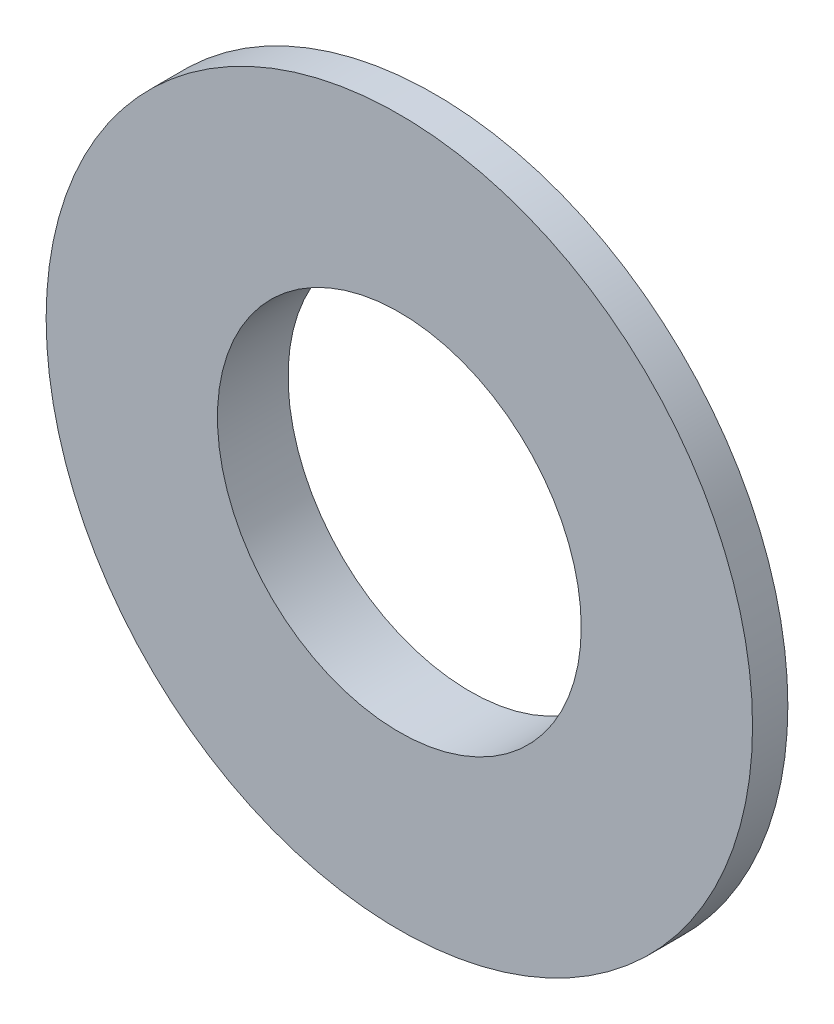
ISO-10303-21;
HEADER;
FILE_DESCRIPTION(('STEP AP214'),'2;1');
FILE_NAME('part.step','',(''),(''),'','','');
FILE_SCHEMA(('AUTOMOTIVE_DESIGN { 1 0 10303 214 1 1 1 1 }'));
ENDSEC;
DATA;
#1=APPLICATION_CONTEXT('core data for automotive mechanical design processes');
#2=APPLICATION_PROTOCOL_DEFINITION('international standard','automotive_design',2000,#1);
#3=PRODUCT_CONTEXT('',#1,'mechanical');
#4=PRODUCT('Part','Part','',(#3));
#5=PRODUCT_RELATED_PRODUCT_CATEGORY('part','',(#4));
#6=PRODUCT_DEFINITION_FORMATION('','',#4);
#7=PRODUCT_DEFINITION_CONTEXT('part definition',#1,'design');
#8=PRODUCT_DEFINITION('design','',#6,#7);
#9=PRODUCT_DEFINITION_SHAPE('','',#8);
#10=(LENGTH_UNIT() NAMED_UNIT(*) SI_UNIT(.MILLI.,.METRE.));
#11=(NAMED_UNIT(*) PLANE_ANGLE_UNIT() SI_UNIT($,.RADIAN.));
#12=(NAMED_UNIT(*) SI_UNIT($,.STERADIAN.) SOLID_ANGLE_UNIT());
#13=UNCERTAINTY_MEASURE_WITH_UNIT(LENGTH_MEASURE(1.E-05),#10,'distance_accuracy_value','');
#14=(GEOMETRIC_REPRESENTATION_CONTEXT(3) GLOBAL_UNCERTAINTY_ASSIGNED_CONTEXT((#13)) GLOBAL_UNIT_ASSIGNED_CONTEXT((#10,
#11,#12)) REPRESENTATION_CONTEXT('',''));
#15=CARTESIAN_POINT('',(0.,0.,0.));
#16=DIRECTION('',(0.,0.,1.));
#17=DIRECTION('',(1.,0.,0.));
#18=AXIS2_PLACEMENT_3D('',#15,#16,#17);
#19=CARTESIAN_POINT('',(0.,0.,1.17672860399254));
#20=DIRECTION('',(0.,0.,1.));
#21=DIRECTION('',(1.,0.,0.));
#22=AXIS2_PLACEMENT_3D('',#19,#20,#21);
#23=PLANE('',#22);
#24=CARTESIAN_POINT('',(0.,0.,1.17672860399254));
#25=DIRECTION('',(0.,0.,1.));
#26=DIRECTION('',(1.,0.,0.));
#27=AXIS2_PLACEMENT_3D('',#24,#25,#26);
#28=CIRCLE('',#27,7.85);
#29=CARTESIAN_POINT('',(7.85,0.,1.17672860399254));
#30=VERTEX_POINT('',#29);
#31=EDGE_CURVE('E39',#30,#30,#28,.T.);
#32=ORIENTED_EDGE('',*,*,#31,.F.);
#33=EDGE_LOOP('',(#32));
#34=FACE_BOUND('',#33,.T.);
#35=CARTESIAN_POINT('',(0.,0.,1.17672860399254));
#36=DIRECTION('',(0.,0.,1.));
#37=DIRECTION('',(1.,0.,0.));
#38=AXIS2_PLACEMENT_3D('',#35,#36,#37);
#39=CIRCLE('',#38,5.15);
#40=CARTESIAN_POINT('',(5.15,0.,1.17672860399254));
#41=VERTEX_POINT('',#40);
#42=EDGE_CURVE('E46',#41,#41,#39,.T.);
#43=ORIENTED_EDGE('',*,*,#42,.T.);
#44=EDGE_LOOP('',(#43));
#45=FACE_BOUND('',#44,.T.);
#46=ADVANCED_FACE('F35',(#34,#45),#23,.F.);
#47=CARTESIAN_POINT('',(0.,0.,2.17672860399254));
#48=DIRECTION('',(0.,0.,-1.));
#49=DIRECTION('',(-1.,0.,0.));
#50=AXIS2_PLACEMENT_3D('',#47,#48,#49);
#51=CYLINDRICAL_SURFACE('',#50,7.85);
#52=CARTESIAN_POINT('',(0.,0.,2.17672860399254));
#53=DIRECTION('',(0.,0.,1.));
#54=DIRECTION('',(1.,0.,0.));
#55=AXIS2_PLACEMENT_3D('',#52,#53,#54);
#56=CIRCLE('',#55,7.85);
#57=CARTESIAN_POINT('',(7.85,0.,2.17672860399254));
#58=VERTEX_POINT('',#57);
#59=EDGE_CURVE('E10',#58,#58,#56,.T.);
#60=ORIENTED_EDGE('',*,*,#59,.F.);
#61=EDGE_LOOP('',(#60));
#62=FACE_BOUND('',#61,.T.);
#63=ORIENTED_EDGE('',*,*,#31,.T.);
#64=EDGE_LOOP('',(#63));
#65=FACE_BOUND('',#64,.T.);
#66=ADVANCED_FACE('F37',(#62,#65),#51,.T.);
#67=CARTESIAN_POINT('',(0.,0.,2.17672860399254));
#68=DIRECTION('',(0.,0.,-1.));
#69=DIRECTION('',(-1.,0.,0.));
#70=AXIS2_PLACEMENT_3D('',#67,#68,#69);
#71=CYLINDRICAL_SURFACE('',#70,5.15);
#72=ORIENTED_EDGE('',*,*,#42,.F.);
#73=EDGE_LOOP('',(#72));
#74=FACE_BOUND('',#73,.T.);
#75=CARTESIAN_POINT('',(0.,0.,3.17672860399254));
#76=DIRECTION('',(0.,0.,1.));
#77=DIRECTION('',(1.,0.,0.));
#78=AXIS2_PLACEMENT_3D('',#75,#76,#77);
#79=CIRCLE('',#78,5.15);
#80=CARTESIAN_POINT('',(5.15,0.,3.17672860399254));
#81=VERTEX_POINT('',#80);
#82=EDGE_CURVE('E54',#81,#81,#79,.F.);
#83=ORIENTED_EDGE('',*,*,#82,.F.);
#84=EDGE_LOOP('',(#83));
#85=FACE_BOUND('',#84,.T.);
#86=ADVANCED_FACE('F63',(#74,#85),#71,.F.);
#87=CARTESIAN_POINT('',(0.,0.,3.17672860399254));
#88=DIRECTION('',(0.,0.,-1.));
#89=DIRECTION('',(-1.,0.,0.));
#90=AXIS2_PLACEMENT_3D('',#87,#88,#89);
#91=CYLINDRICAL_SURFACE('',#90,10.);
#92=CARTESIAN_POINT('',(0.,0.,3.17672860399254));
#93=DIRECTION('',(0.,0.,1.));
#94=DIRECTION('',(1.,0.,0.));
#95=AXIS2_PLACEMENT_3D('',#92,#93,#94);
#96=CIRCLE('',#95,10.);
#97=CARTESIAN_POINT('',(10.,0.,3.17672860399254));
#98=VERTEX_POINT('',#97);
#99=EDGE_CURVE('E50',#98,#98,#96,.T.);
#100=ORIENTED_EDGE('',*,*,#99,.F.);
#101=EDGE_LOOP('',(#100));
#102=FACE_BOUND('',#101,.T.);
#103=CARTESIAN_POINT('',(0.,0.,2.17672860399254));
#104=DIRECTION('',(0.,0.,1.));
#105=DIRECTION('',(1.,0.,0.));
#106=AXIS2_PLACEMENT_3D('',#103,#104,#105);
#107=CIRCLE('',#106,10.);
#108=CARTESIAN_POINT('',(10.,0.,2.17672860399254));
#109=VERTEX_POINT('',#108);
#110=EDGE_CURVE('E51',#109,#109,#107,.T.);
#111=ORIENTED_EDGE('',*,*,#110,.T.);
#112=EDGE_LOOP('',(#111));
#113=FACE_BOUND('',#112,.T.);
#114=ADVANCED_FACE('F65',(#102,#113),#91,.T.);
#115=CARTESIAN_POINT('',(0.,0.,3.17672860399254));
#116=DIRECTION('',(0.,0.,1.));
#117=DIRECTION('',(1.,0.,0.));
#118=AXIS2_PLACEMENT_3D('',#115,#116,#117);
#119=PLANE('',#118);
#120=ORIENTED_EDGE('',*,*,#82,.T.);
#121=EDGE_LOOP('',(#120));
#122=FACE_BOUND('',#121,.T.);
#123=ORIENTED_EDGE('',*,*,#99,.T.);
#124=EDGE_LOOP('',(#123));
#125=FACE_BOUND('',#124,.T.);
#126=ADVANCED_FACE('F60',(#122,#125),#119,.T.);
#127=CARTESIAN_POINT('',(0.,0.,2.17672860399254));
#128=DIRECTION('',(0.,0.,1.));
#129=DIRECTION('',(1.,0.,0.));
#130=AXIS2_PLACEMENT_3D('',#127,#128,#129);
#131=PLANE('',#130);
#132=ORIENTED_EDGE('',*,*,#59,.T.);
#133=EDGE_LOOP('',(#132));
#134=FACE_BOUND('',#133,.T.);
#135=ORIENTED_EDGE('',*,*,#110,.F.);
#136=EDGE_LOOP('',(#135));
#137=FACE_BOUND('',#136,.T.);
#138=ADVANCED_FACE('F108',(#134,#137),#131,.F.);
#139=CLOSED_SHELL('',(#46,#66,#86,#114,#126,#138));
#140=MANIFOLD_SOLID_BREP('B2',#139);
#141=ADVANCED_BREP_SHAPE_REPRESENTATION('',(#18,#140),#14);
#142=SHAPE_DEFINITION_REPRESENTATION(#9,#141);
ENDSEC;
END-ISO-10303-21;
